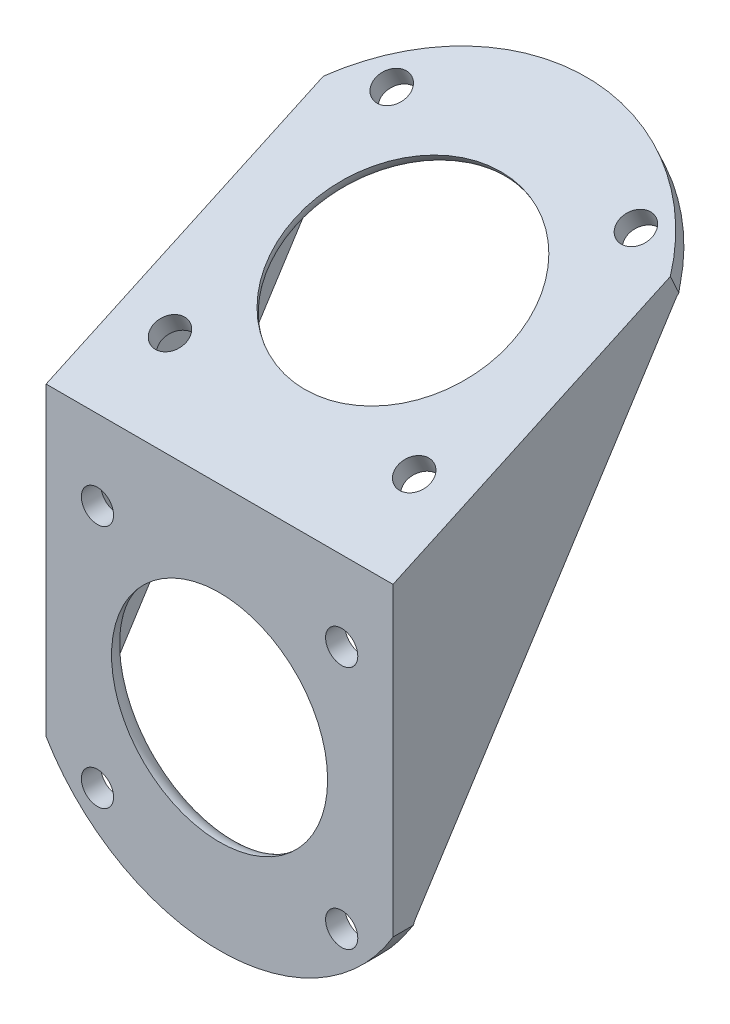
ISO-10303-21;
HEADER;
FILE_DESCRIPTION(('STEP AP214'),'2;1');
FILE_NAME('part.step','',(''),(''),'','','');
FILE_SCHEMA(('AUTOMOTIVE_DESIGN { 1 0 10303 214 1 1 1 1 }'));
ENDSEC;
DATA;
#1=APPLICATION_CONTEXT('core data for automotive mechanical design processes');
#2=APPLICATION_PROTOCOL_DEFINITION('international standard','automotive_design',2000,#1);
#3=PRODUCT_CONTEXT('',#1,'mechanical');
#4=PRODUCT('Part','Part','',(#3));
#5=PRODUCT_RELATED_PRODUCT_CATEGORY('part','',(#4));
#6=PRODUCT_DEFINITION_FORMATION('','',#4);
#7=PRODUCT_DEFINITION_CONTEXT('part definition',#1,'design');
#8=PRODUCT_DEFINITION('design','',#6,#7);
#9=PRODUCT_DEFINITION_SHAPE('','',#8);
#10=(LENGTH_UNIT() NAMED_UNIT(*) SI_UNIT(.MILLI.,.METRE.));
#11=(NAMED_UNIT(*) PLANE_ANGLE_UNIT() SI_UNIT($,.RADIAN.));
#12=(NAMED_UNIT(*) SI_UNIT($,.STERADIAN.) SOLID_ANGLE_UNIT());
#13=UNCERTAINTY_MEASURE_WITH_UNIT(LENGTH_MEASURE(1.E-05),#10,'distance_accuracy_value','');
#14=(GEOMETRIC_REPRESENTATION_CONTEXT(3) GLOBAL_UNCERTAINTY_ASSIGNED_CONTEXT((#13)) GLOBAL_UNIT_ASSIGNED_CONTEXT((#10,
#11,#12)) REPRESENTATION_CONTEXT('',''));
#15=CARTESIAN_POINT('',(0.,0.,0.));
#16=DIRECTION('',(0.,0.,1.));
#17=DIRECTION('',(1.,0.,0.));
#18=AXIS2_PLACEMENT_3D('',#15,#16,#17);
#19=CARTESIAN_POINT('',(0.,0.,0.));
#20=DIRECTION('',(0.,0.,1.));
#21=DIRECTION('',(1.,0.,0.));
#22=AXIS2_PLACEMENT_3D('',#19,#20,#21);
#23=PLANE('',#22);
#24=CARTESIAN_POINT('',(0.,0.,0.));
#25=DIRECTION('',(0.,0.,1.));
#26=DIRECTION('',(1.,0.,0.));
#27=AXIS2_PLACEMENT_3D('',#24,#25,#26);
#28=CIRCLE('',#27,13.07313);
#29=CARTESIAN_POINT('',(13.07313,0.,0.));
#30=VERTEX_POINT('',#29);
#31=EDGE_CURVE('E206',#30,#30,#28,.T.);
#32=ORIENTED_EDGE('',*,*,#31,.T.);
#33=EDGE_LOOP('',(#32));
#34=FACE_BOUND('',#33,.T.);
#35=CARTESIAN_POINT('',(-12.5157900270019,12.5157900270019,0.));
#36=DIRECTION('',(0.,0.,1.));
#37=DIRECTION('',(1.,0.,0.));
#38=AXIS2_PLACEMENT_3D('',#35,#36,#37);
#39=CIRCLE('',#38,1.651);
#40=CARTESIAN_POINT('',(-10.8647900270019,12.5157900270019,0.));
#41=VERTEX_POINT('',#40);
#42=EDGE_CURVE('E163',#41,#41,#39,.T.);
#43=ORIENTED_EDGE('',*,*,#42,.T.);
#44=EDGE_LOOP('',(#43));
#45=FACE_BOUND('',#44,.T.);
#46=CARTESIAN_POINT('',(12.5157900270019,-12.5157900270019,0.));
#47=DIRECTION('',(0.,0.,1.));
#48=DIRECTION('',(1.,0.,0.));
#49=AXIS2_PLACEMENT_3D('',#46,#47,#48);
#50=CIRCLE('',#49,1.651);
#51=CARTESIAN_POINT('',(14.1667900270019,-12.5157900270019,0.));
#52=VERTEX_POINT('',#51);
#53=EDGE_CURVE('E173',#52,#52,#50,.T.);
#54=ORIENTED_EDGE('',*,*,#53,.T.);
#55=EDGE_LOOP('',(#54));
#56=FACE_BOUND('',#55,.T.);
#57=CARTESIAN_POINT('',(-12.5157900270019,-12.5157900270019,0.));
#58=DIRECTION('',(0.,0.,1.));
#59=DIRECTION('',(1.,0.,0.));
#60=AXIS2_PLACEMENT_3D('',#57,#58,#59);
#61=CIRCLE('',#60,1.651);
#62=CARTESIAN_POINT('',(-10.8647900270019,-12.5157900270019,0.));
#63=VERTEX_POINT('',#62);
#64=EDGE_CURVE('E179',#63,#63,#61,.T.);
#65=ORIENTED_EDGE('',*,*,#64,.T.);
#66=EDGE_LOOP('',(#65));
#67=FACE_BOUND('',#66,.T.);
#68=CARTESIAN_POINT('',(12.5157900270019,12.5157900270019,0.));
#69=DIRECTION('',(0.,0.,1.));
#70=DIRECTION('',(1.,0.,0.));
#71=AXIS2_PLACEMENT_3D('',#68,#69,#70);
#72=CIRCLE('',#71,1.651);
#73=CARTESIAN_POINT('',(14.1667900270019,12.5157900270019,0.));
#74=VERTEX_POINT('',#73);
#75=EDGE_CURVE('E167',#74,#74,#72,.T.);
#76=ORIENTED_EDGE('',*,*,#75,.T.);
#77=EDGE_LOOP('',(#76));
#78=FACE_BOUND('',#77,.T.);
#79=DIRECTION('',(0.,1.,0.));
#80=VECTOR('',#79,1.);
#81=CARTESIAN_POINT('',(15.78,19.4214547521063,0.));
#82=LINE('',#81,#80);
#83=CARTESIAN_POINT('',(15.78,-11.1870585452423,0.));
#84=VERTEX_POINT('',#83);
#85=CARTESIAN_POINT('',(15.78,19.4214547521063,0.));
#86=VERTEX_POINT('',#85);
#87=EDGE_CURVE('E323',#84,#86,#82,.T.);
#88=ORIENTED_EDGE('',*,*,#87,.F.);
#89=DIRECTION('',(1.,0.,0.));
#90=VECTOR('',#89,1.);
#91=CARTESIAN_POINT('',(17.78,-11.1870585452423,0.));
#92=LINE('',#91,#90);
#93=CARTESIAN_POINT('',(17.4178391916254,-11.1870585452423,0.));
#94=VERTEX_POINT('',#93);
#95=EDGE_CURVE('E212',#84,#94,#92,.T.);
#96=ORIENTED_EDGE('',*,*,#95,.T.);
#97=CARTESIAN_POINT('',(0.,0.,0.));
#98=DIRECTION('',(0.,0.,1.));
#99=DIRECTION('',(1.,0.,0.));
#100=AXIS2_PLACEMENT_3D('',#97,#98,#99);
#101=CIRCLE('',#100,20.701);
#102=CARTESIAN_POINT('',(-17.4178391916254,-11.1870585452423,0.));
#103=VERTEX_POINT('',#102);
#104=EDGE_CURVE('E185',#103,#94,#101,.T.);
#105=ORIENTED_EDGE('',*,*,#104,.F.);
#106=DIRECTION('',(-1.,0.,0.));
#107=VECTOR('',#106,1.);
#108=CARTESIAN_POINT('',(0.,-11.1870585452423,0.));
#109=LINE('',#108,#107);
#110=CARTESIAN_POINT('',(-15.78,-11.1870585452423,0.));
#111=VERTEX_POINT('',#110);
#112=EDGE_CURVE('E209',#103,#111,#109,.F.);
#113=ORIENTED_EDGE('',*,*,#112,.T.);
#114=DIRECTION('',(0.,1.,0.));
#115=VECTOR('',#114,1.);
#116=CARTESIAN_POINT('',(-15.78,19.4214547521063,0.));
#117=LINE('',#116,#115);
#118=CARTESIAN_POINT('',(-15.78,19.4214547521063,0.));
#119=VERTEX_POINT('',#118);
#120=EDGE_CURVE('E306',#111,#119,#117,.T.);
#121=ORIENTED_EDGE('',*,*,#120,.T.);
#122=DIRECTION('',(-1.,0.,0.));
#123=VECTOR('',#122,1.);
#124=CARTESIAN_POINT('',(0.,19.4214547521063,0.));
#125=LINE('',#124,#123);
#126=EDGE_CURVE('E137',#86,#119,#125,.T.);
#127=ORIENTED_EDGE('',*,*,#126,.F.);
#128=EDGE_LOOP('',(#88,#96,#105,#113,#121,#127));
#129=FACE_BOUND('',#128,.T.);
#130=ADVANCED_FACE('F32',(#34,#45,#56,#67,#78,#129),#23,.F.);
#131=CARTESIAN_POINT('',(0.,27.5616697394959,-17.6332017695934));
#132=DIRECTION('',(0.,0.907923839622828,0.419135182780617));
#133=DIRECTION('',(1.,0.,0.));
#134=AXIS2_PLACEMENT_3D('',#131,#132,#133);
#135=PLANE('',#134);
#136=CARTESIAN_POINT('',(0.,27.5616697394959,-17.6332017695934));
#137=DIRECTION('',(0.,0.907923839622828,0.419135182780617));
#138=DIRECTION('',(0.,-0.419135182780617,0.907923839622828));
#139=AXIS2_PLACEMENT_3D('',#136,#137,#138);
#140=CIRCLE('',#139,13.07313);
#141=CARTESIAN_POINT('',(0.,22.0822610074311,-5.763795384105));
#142=VERTEX_POINT('',#141);
#143=EDGE_CURVE('E203',#142,#142,#140,.T.);
#144=ORIENTED_EDGE('',*,*,#143,.T.);
#145=EDGE_LOOP('',(#144));
#146=FACE_BOUND('',#145,.T.);
#147=CARTESIAN_POINT('',(-12.5157900270019,22.3158617988846,-6.26981763236474));
#148=DIRECTION('',(0.,-0.907923839622828,-0.419135182780617));
#149=DIRECTION('',(1.,0.,0.));
#150=AXIS2_PLACEMENT_3D('',#147,#148,#149);
#151=CIRCLE('',#150,1.651);
#152=CARTESIAN_POINT('',(-10.8647900270019,22.3158617988846,-6.26981763236474));
#153=VERTEX_POINT('',#152);
#154=EDGE_CURVE('E343',#153,#153,#151,.T.);
#155=ORIENTED_EDGE('',*,*,#154,.F.);
#156=EDGE_LOOP('',(#155));
#157=FACE_BOUND('',#156,.T.);
#158=CARTESIAN_POINT('',(12.5157900270019,22.3158617988846,-6.26981763236474));
#159=DIRECTION('',(0.,-0.907923839622828,-0.419135182780617));
#160=DIRECTION('',(1.,0.,0.));
#161=AXIS2_PLACEMENT_3D('',#158,#159,#160);
#162=CIRCLE('',#161,1.651);
#163=CARTESIAN_POINT('',(14.1667900270019,22.3158617988846,-6.26981763236474));
#164=VERTEX_POINT('',#163);
#165=EDGE_CURVE('E347',#164,#164,#162,.T.);
#166=ORIENTED_EDGE('',*,*,#165,.F.);
#167=EDGE_LOOP('',(#166));
#168=FACE_BOUND('',#167,.T.);
#169=CARTESIAN_POINT('',(12.5157900270019,32.8074776801072,-28.996585906822));
#170=DIRECTION('',(0.,-0.907923839622828,-0.419135182780617));
#171=DIRECTION('',(1.,0.,0.));
#172=AXIS2_PLACEMENT_3D('',#169,#170,#171);
#173=CIRCLE('',#172,1.651);
#174=CARTESIAN_POINT('',(14.1667900270019,32.8074776801072,-28.996585906822));
#175=VERTEX_POINT('',#174);
#176=EDGE_CURVE('E353',#175,#175,#173,.T.);
#177=ORIENTED_EDGE('',*,*,#176,.F.);
#178=EDGE_LOOP('',(#177));
#179=FACE_BOUND('',#178,.T.);
#180=CARTESIAN_POINT('',(-12.5157900270019,32.8074776801072,-28.996585906822));
#181=DIRECTION('',(0.,-0.907923839622828,-0.419135182780617));
#182=DIRECTION('',(1.,0.,0.));
#183=AXIS2_PLACEMENT_3D('',#180,#181,#182);
#184=CIRCLE('',#183,1.651);
#185=CARTESIAN_POINT('',(-10.8647900270019,32.8074776801072,-28.996585906822));
#186=VERTEX_POINT('',#185);
#187=EDGE_CURVE('E359',#186,#186,#184,.T.);
#188=ORIENTED_EDGE('',*,*,#187,.F.);
#189=EDGE_LOOP('',(#188));
#190=FACE_BOUND('',#189,.T.);
#191=DIRECTION('',(0.,0.419135182780617,-0.907923839622828));
#192=VECTOR('',#191,1.);
#193=CARTESIAN_POINT('',(-15.78,32.0053527480987,-27.2590358798955));
#194=LINE('',#193,#192);
#195=CARTESIAN_POINT('',(-15.78,32.2505595676335,-27.7901989180751));
#196=VERTEX_POINT('',#195);
#197=EDGE_CURVE('E311',#119,#196,#194,.T.);
#198=ORIENTED_EDGE('',*,*,#197,.T.);
#199=DIRECTION('',(-1.,0.,0.));
#200=VECTOR('',#199,1.);
#201=CARTESIAN_POINT('',(0.,32.2505595676335,-27.7901989180751));
#202=LINE('',#201,#200);
#203=CARTESIAN_POINT('',(-17.4178391916254,32.2505595676335,-27.7901989180751));
#204=VERTEX_POINT('',#203);
#205=EDGE_CURVE('E228',#196,#204,#202,.T.);
#206=ORIENTED_EDGE('',*,*,#205,.T.);
#207=CARTESIAN_POINT('',(0.,27.5616697394959,-17.6332017695934));
#208=DIRECTION('',(0.,-0.907923839622828,-0.419135182780617));
#209=DIRECTION('',(1.,0.,0.));
#210=AXIS2_PLACEMENT_3D('',#207,#208,#209);
#211=CIRCLE('',#210,20.701);
#212=CARTESIAN_POINT('',(17.4178391916254,32.2505595676335,-27.7901989180751));
#213=VERTEX_POINT('',#212);
#214=EDGE_CURVE('E145',#204,#213,#211,.T.);
#215=ORIENTED_EDGE('',*,*,#214,.T.);
#216=DIRECTION('',(1.,0.,0.));
#217=VECTOR('',#216,1.);
#218=CARTESIAN_POINT('',(15.78,32.2505595676335,-27.7901989180751));
#219=LINE('',#218,#217);
#220=CARTESIAN_POINT('',(15.78,32.2505595676335,-27.7901989180751));
#221=VERTEX_POINT('',#220);
#222=EDGE_CURVE('E225',#213,#221,#219,.F.);
#223=ORIENTED_EDGE('',*,*,#222,.T.);
#224=DIRECTION('',(0.,0.419135182780617,-0.907923839622828));
#225=VECTOR('',#224,1.);
#226=CARTESIAN_POINT('',(15.78,32.0053527480987,-27.2590358798955));
#227=LINE('',#226,#225);
#228=EDGE_CURVE('E307',#86,#221,#227,.T.);
#229=ORIENTED_EDGE('',*,*,#228,.F.);
#230=ORIENTED_EDGE('',*,*,#126,.T.);
#231=EDGE_LOOP('',(#198,#206,#215,#223,#229,#230));
#232=FACE_BOUND('',#231,.T.);
#233=ADVANCED_FACE('F280',(#146,#157,#168,#179,#190,#232),#135,.F.);
#234=CARTESIAN_POINT('',(0.,0.,2.));
#235=DIRECTION('',(0.,0.,1.));
#236=DIRECTION('',(1.,0.,0.));
#237=AXIS2_PLACEMENT_3D('',#234,#235,#236);
#238=PLANE('',#237);
#239=CARTESIAN_POINT('',(-12.5157900270019,12.5157900270019,2.));
#240=DIRECTION('',(0.,0.,1.));
#241=DIRECTION('',(1.,0.,0.));
#242=AXIS2_PLACEMENT_3D('',#239,#240,#241);
#243=CIRCLE('',#242,1.651);
#244=CARTESIAN_POINT('',(-10.8647900270019,12.5157900270019,2.));
#245=VERTEX_POINT('',#244);
#246=EDGE_CURVE('E164',#245,#245,#243,.T.);
#247=ORIENTED_EDGE('',*,*,#246,.F.);
#248=EDGE_LOOP('',(#247));
#249=FACE_BOUND('',#248,.T.);
#250=CARTESIAN_POINT('',(12.5157900270019,-12.5157900270019,2.));
#251=DIRECTION('',(0.,0.,1.));
#252=DIRECTION('',(1.,0.,0.));
#253=AXIS2_PLACEMENT_3D('',#250,#251,#252);
#254=CIRCLE('',#253,1.651);
#255=CARTESIAN_POINT('',(14.1667900270019,-12.5157900270019,2.));
#256=VERTEX_POINT('',#255);
#257=EDGE_CURVE('E176',#256,#256,#254,.T.);
#258=ORIENTED_EDGE('',*,*,#257,.F.);
#259=EDGE_LOOP('',(#258));
#260=FACE_BOUND('',#259,.T.);
#261=CARTESIAN_POINT('',(0.,0.,2.));
#262=DIRECTION('',(0.,0.,1.));
#263=DIRECTION('',(1.,0.,0.));
#264=AXIS2_PLACEMENT_3D('',#261,#262,#263);
#265=CIRCLE('',#264,20.701);
#266=CARTESIAN_POINT('',(-17.78,-10.6020281550277,2.));
#267=VERTEX_POINT('',#266);
#268=CARTESIAN_POINT('',(17.78,-10.6020281550277,2.));
#269=VERTEX_POINT('',#268);
#270=EDGE_CURVE('E188',#267,#269,#265,.T.);
#271=ORIENTED_EDGE('',*,*,#270,.T.);
#272=DIRECTION('',(0.,1.,0.));
#273=VECTOR('',#272,1.);
#274=CARTESIAN_POINT('',(17.78,-10.6020281550277,2.));
#275=LINE('',#274,#273);
#276=CARTESIAN_POINT('',(17.78,20.701,2.00000000000001));
#277=VERTEX_POINT('',#276);
#278=EDGE_CURVE('E191',#269,#277,#275,.T.);
#279=ORIENTED_EDGE('',*,*,#278,.T.);
#280=DIRECTION('',(-1.,0.,0.));
#281=VECTOR('',#280,1.);
#282=CARTESIAN_POINT('',(-17.78,20.701,2.));
#283=LINE('',#282,#281);
#284=CARTESIAN_POINT('',(-17.78,20.701,2.));
#285=VERTEX_POINT('',#284);
#286=EDGE_CURVE('E194',#277,#285,#283,.T.);
#287=ORIENTED_EDGE('',*,*,#286,.T.);
#288=DIRECTION('',(0.,-1.,0.));
#289=VECTOR('',#288,1.);
#290=CARTESIAN_POINT('',(-17.78,-10.6020281550277,2.));
#291=LINE('',#290,#289);
#292=EDGE_CURVE('E150',#285,#267,#291,.T.);
#293=ORIENTED_EDGE('',*,*,#292,.T.);
#294=EDGE_LOOP('',(#271,#279,#287,#293));
#295=FACE_BOUND('',#294,.T.);
#296=CARTESIAN_POINT('',(-12.5157900270019,-12.5157900270019,2.));
#297=DIRECTION('',(0.,0.,1.));
#298=DIRECTION('',(1.,0.,0.));
#299=AXIS2_PLACEMENT_3D('',#296,#297,#298);
#300=CIRCLE('',#299,1.651);
#301=CARTESIAN_POINT('',(-10.8647900270019,-12.5157900270019,2.));
#302=VERTEX_POINT('',#301);
#303=EDGE_CURVE('E182',#302,#302,#300,.T.);
#304=ORIENTED_EDGE('',*,*,#303,.F.);
#305=EDGE_LOOP('',(#304));
#306=FACE_BOUND('',#305,.T.);
#307=CARTESIAN_POINT('',(12.5157900270019,12.5157900270019,2.));
#308=DIRECTION('',(0.,0.,1.));
#309=DIRECTION('',(1.,0.,0.));
#310=AXIS2_PLACEMENT_3D('',#307,#308,#309);
#311=CIRCLE('',#310,1.651);
#312=CARTESIAN_POINT('',(14.1667900270019,12.5157900270019,2.));
#313=VERTEX_POINT('',#312);
#314=EDGE_CURVE('E170',#313,#313,#311,.T.);
#315=ORIENTED_EDGE('',*,*,#314,.F.);
#316=EDGE_LOOP('',(#315));
#317=FACE_BOUND('',#316,.T.);
#318=CARTESIAN_POINT('',(0.,0.,2.));
#319=DIRECTION('',(0.,0.,1.));
#320=DIRECTION('',(1.,0.,0.));
#321=AXIS2_PLACEMENT_3D('',#318,#319,#320);
#322=CIRCLE('',#321,11.07313);
#323=CARTESIAN_POINT('',(11.07313,0.,2.));
#324=VERTEX_POINT('',#323);
#325=EDGE_CURVE('E160',#324,#324,#322,.T.);
#326=ORIENTED_EDGE('',*,*,#325,.F.);
#327=EDGE_LOOP('',(#326));
#328=FACE_BOUND('',#327,.T.);
#329=ADVANCED_FACE('F369',(#249,#260,#295,#306,#317,#328),#238,.T.);
#330=CARTESIAN_POINT('',(0.,0.,2.));
#331=DIRECTION('',(0.,0.,-1.));
#332=DIRECTION('',(-1.,0.,0.));
#333=AXIS2_PLACEMENT_3D('',#330,#331,#332);
#334=CYLINDRICAL_SURFACE('',#333,20.701);
#335=DIRECTION('',(0.,0.,-1.));
#336=VECTOR('',#335,1.);
#337=CARTESIAN_POINT('',(-17.78,-10.6020281550277,2.));
#338=LINE('',#337,#336);
#339=CARTESIAN_POINT('',(-17.78,-10.6020281550277,-0.0874782504438334));
#340=VERTEX_POINT('',#339);
#341=EDGE_CURVE('E197',#267,#340,#338,.T.);
#342=ORIENTED_EDGE('',*,*,#341,.T.);
#343=CARTESIAN_POINT('',(-17.78,-10.6020281550277,-0.0874782504438332));
#344=CARTESIAN_POINT('',(-17.7512279440699,-10.6502827459432,-0.072717126070131));
#345=CARTESIAN_POINT('',(-17.7220046579674,-10.6988419886516,-0.0598603438074818));
#346=CARTESIAN_POINT('',(-17.6629033146214,-10.7961316553277,-0.0379470868485084));
#347=CARTESIAN_POINT('',(-17.6330284914694,-10.8448605239403,-0.0288750067908097));
#348=CARTESIAN_POINT('',(-17.5726314536715,-10.942454864309,-0.0144011258893351));
#349=CARTESIAN_POINT('',(-17.5421092700097,-10.9913203294306,-0.00899914979370105));
#350=CARTESIAN_POINT('',(-17.4804077530037,-11.0891893010427,-0.00179106641959754));
#351=CARTESIAN_POINT('',(-17.4492262051928,-11.138192530159,-9.22016693959539E-08));
#352=CARTESIAN_POINT('',(-17.4178391916254,-11.1870585452423,0.));
#353=B_SPLINE_CURVE_WITH_KNOTS('',3,(#343,#344,#345,#346,#347,#348,#349,#350,#351,#352),
.UNSPECIFIED.,.F.,.F.,(4,2,2,2,4),(0.,0.174220067104702,0.347714502447699,0.521200652641305,
0.695412353425017),.UNSPECIFIED.);
#354=EDGE_CURVE('E259',#340,#103,#353,.T.);
#355=ORIENTED_EDGE('',*,*,#354,.T.);
#356=ORIENTED_EDGE('',*,*,#104,.T.);
#357=CARTESIAN_POINT('',(17.4178391916254,-11.1870585452423,0.));
#358=CARTESIAN_POINT('',(17.4492262051928,-11.138192530159,-9.22016684831085E-08));
#359=CARTESIAN_POINT('',(17.4804077530037,-11.0891893010427,-0.00179106641959657));
#360=CARTESIAN_POINT('',(17.5421092700097,-10.9913203294306,-0.00899914979370044));
#361=CARTESIAN_POINT('',(17.5726314536715,-10.942454864309,-0.014401125889335));
#362=CARTESIAN_POINT('',(17.6330284914694,-10.8448605239403,-0.0288750067908099));
#363=CARTESIAN_POINT('',(17.6629033146214,-10.7961316553277,-0.0379470868485084));
#364=CARTESIAN_POINT('',(17.7220046579674,-10.6988419886516,-0.0598603438074816));
#365=CARTESIAN_POINT('',(17.7512279440699,-10.6502827459432,-0.0727171260701309));
#366=CARTESIAN_POINT('',(17.78,-10.6020281550277,-0.0874782504438338));
#367=B_SPLINE_CURVE_WITH_KNOTS('',3,(#357,#358,#359,#360,#361,#362,#363,#364,#365,#366),
.UNSPECIFIED.,.F.,.F.,(4,2,2,2,4),(0.,0.174211700783711,0.347697850977319,0.521192286320317,
0.695412353425021),.UNSPECIFIED.);
#368=CARTESIAN_POINT('',(17.78,-10.6020281550277,-0.0874782504438334));
#369=VERTEX_POINT('',#368);
#370=EDGE_CURVE('E231',#94,#369,#367,.T.);
#371=ORIENTED_EDGE('',*,*,#370,.T.);
#372=DIRECTION('',(0.,0.,-1.));
#373=VECTOR('',#372,1.);
#374=CARTESIAN_POINT('',(17.78,-10.6020281550277,2.));
#375=LINE('',#374,#373);
#376=EDGE_CURVE('E201',#269,#369,#375,.T.);
#377=ORIENTED_EDGE('',*,*,#376,.F.);
#378=ORIENTED_EDGE('',*,*,#270,.F.);
#379=EDGE_LOOP('',(#342,#355,#356,#371,#377,#378));
#380=FACE_BOUND('',#379,.T.);
#381=ADVANCED_FACE('F241',(#380),#334,.T.);
#382=CARTESIAN_POINT('',(17.78,-10.6020281550277,2.));
#383=DIRECTION('',(-1.,0.,0.));
#384=DIRECTION('',(0.,0.,1.));
#385=AXIS2_PLACEMENT_3D('',#382,#383,#384);
#386=PLANE('',#385);
#387=DIRECTION('',(0.,-0.419135182780617,0.907923839622828));
#388=VECTOR('',#387,1.);
#389=CARTESIAN_POINT('',(17.78,33.8212004273443,-26.4207655143342));
#390=LINE('',#389,#388);
#391=CARTESIAN_POINT('',(17.78,33.8212004273443,-26.4207655143342));
#392=VERTEX_POINT('',#391);
#393=EDGE_CURVE('E144',#392,#277,#390,.T.);
#394=ORIENTED_EDGE('',*,*,#393,.T.);
#395=ORIENTED_EDGE('',*,*,#278,.F.);
#396=ORIENTED_EDGE('',*,*,#376,.T.);
#397=CARTESIAN_POINT('',(17.78,-11.1870585452423,-2.));
#398=DIRECTION('',(-1.,0.,0.));
#399=DIRECTION('',(0.,0.,1.));
#400=AXIS2_PLACEMENT_3D('',#397,#398,#399);
#401=CIRCLE('',#400,2.);
#402=CARTESIAN_POINT('',(17.78,-10.1092229202796,-0.315283298129554));
#403=VERTEX_POINT('',#402);
#404=EDGE_CURVE('E239',#369,#403,#401,.T.);
#405=ORIENTED_EDGE('',*,*,#404,.T.);
#406=DIRECTION('',(0.,-0.842358350935223,0.538917812481357));
#407=VECTOR('',#406,1.);
#408=CARTESIAN_POINT('',(17.78,-10.6020281550277,0.));
#409=LINE('',#408,#407);
#410=CARTESIAN_POINT('',(17.78,31.5125475133505,-26.9437525817659));
#411=VERTEX_POINT('',#410);
#412=EDGE_CURVE('E330',#411,#403,#409,.T.);
#413=ORIENTED_EDGE('',*,*,#412,.F.);
#414=CARTESIAN_POINT('',(17.78,30.4347118883878,-28.6284692836364));
#415=DIRECTION('',(-1.,0.,0.));
#416=DIRECTION('',(0.,0.,1.));
#417=AXIS2_PLACEMENT_3D('',#414,#415,#416);
#418=CIRCLE('',#417,2.);
#419=CARTESIAN_POINT('',(17.78,31.9259291590722,-27.2957010923846));
#420=VERTEX_POINT('',#419);
#421=EDGE_CURVE('E288',#411,#420,#418,.T.);
#422=ORIENTED_EDGE('',*,*,#421,.T.);
#423=DIRECTION('',(0.,-0.907923839622828,-0.419135182780617));
#424=VECTOR('',#423,1.);
#425=CARTESIAN_POINT('',(17.78,33.8212004273443,-26.4207655143342));
#426=LINE('',#425,#424);
#427=EDGE_CURVE('E48',#392,#420,#426,.T.);
#428=ORIENTED_EDGE('',*,*,#427,.F.);
#429=EDGE_LOOP('',(#394,#395,#396,#405,#413,#422,#428));
#430=FACE_BOUND('',#429,.T.);
#431=ADVANCED_FACE('F473',(#430),#386,.F.);
#432=CARTESIAN_POINT('',(-17.78,-10.6020281550277,2.));
#433=DIRECTION('',(1.,0.,0.));
#434=DIRECTION('',(0.,0.,-1.));
#435=AXIS2_PLACEMENT_3D('',#432,#433,#434);
#436=PLANE('',#435);
#437=DIRECTION('',(0.,-0.907923839622828,-0.419135182780617));
#438=VECTOR('',#437,1.);
#439=CARTESIAN_POINT('',(-17.78,33.8212004273443,-26.4207655143342));
#440=LINE('',#439,#438);
#441=CARTESIAN_POINT('',(-17.78,33.8212004273443,-26.4207655143342));
#442=VERTEX_POINT('',#441);
#443=CARTESIAN_POINT('',(-17.78,31.9259291590722,-27.2957010923846));
#444=VERTEX_POINT('',#443);
#445=EDGE_CURVE('E56',#442,#444,#440,.T.);
#446=ORIENTED_EDGE('',*,*,#445,.T.);
#447=CARTESIAN_POINT('',(-17.78,30.4347118883878,-28.6284692836364));
#448=DIRECTION('',(1.,0.,0.));
#449=DIRECTION('',(0.,0.,-1.));
#450=AXIS2_PLACEMENT_3D('',#447,#448,#449);
#451=CIRCLE('',#450,2.);
#452=CARTESIAN_POINT('',(-17.78,31.5125475133505,-26.9437525817659));
#453=VERTEX_POINT('',#452);
#454=EDGE_CURVE('E273',#444,#453,#451,.T.);
#455=ORIENTED_EDGE('',*,*,#454,.T.);
#456=DIRECTION('',(0.,-0.842358350935223,0.538917812481357));
#457=VECTOR('',#456,1.);
#458=CARTESIAN_POINT('',(-17.78,-10.6020281550277,0.));
#459=LINE('',#458,#457);
#460=CARTESIAN_POINT('',(-17.78,-10.1092229202796,-0.315283298129554));
#461=VERTEX_POINT('',#460);
#462=EDGE_CURVE('E299',#453,#461,#459,.T.);
#463=ORIENTED_EDGE('',*,*,#462,.T.);
#464=CARTESIAN_POINT('',(-17.78,-11.1870585452423,-2.));
#465=DIRECTION('',(1.,0.,0.));
#466=DIRECTION('',(0.,0.,-1.));
#467=AXIS2_PLACEMENT_3D('',#464,#465,#466);
#468=CIRCLE('',#467,2.);
#469=EDGE_CURVE('E266',#461,#340,#468,.T.);
#470=ORIENTED_EDGE('',*,*,#469,.T.);
#471=ORIENTED_EDGE('',*,*,#341,.F.);
#472=ORIENTED_EDGE('',*,*,#292,.F.);
#473=DIRECTION('',(0.,0.419135182780617,-0.907923839622828));
#474=VECTOR('',#473,1.);
#475=CARTESIAN_POINT('',(-17.78,33.8212004273443,-26.4207655143342));
#476=LINE('',#475,#474);
#477=EDGE_CURVE('E141',#285,#442,#476,.T.);
#478=ORIENTED_EDGE('',*,*,#477,.T.);
#479=EDGE_LOOP('',(#446,#455,#463,#470,#471,#472,#478));
#480=FACE_BOUND('',#479,.T.);
#481=ADVANCED_FACE('F148',(#480),#436,.F.);
#482=CARTESIAN_POINT('',(-12.5157900270019,-12.5157900270019,2.));
#483=DIRECTION('',(0.,0.,-1.));
#484=DIRECTION('',(-1.,0.,0.));
#485=AXIS2_PLACEMENT_3D('',#482,#483,#484);
#486=CYLINDRICAL_SURFACE('',#485,1.651);
#487=ORIENTED_EDGE('',*,*,#303,.T.);
#488=EDGE_LOOP('',(#487));
#489=FACE_BOUND('',#488,.T.);
#490=ORIENTED_EDGE('',*,*,#64,.F.);
#491=EDGE_LOOP('',(#490));
#492=FACE_BOUND('',#491,.T.);
#493=ADVANCED_FACE('F465',(#489,#492),#486,.F.);
#494=CARTESIAN_POINT('',(12.5157900270019,-12.5157900270019,2.));
#495=DIRECTION('',(0.,0.,-1.));
#496=DIRECTION('',(-1.,0.,0.));
#497=AXIS2_PLACEMENT_3D('',#494,#495,#496);
#498=CYLINDRICAL_SURFACE('',#497,1.651);
#499=ORIENTED_EDGE('',*,*,#257,.T.);
#500=EDGE_LOOP('',(#499));
#501=FACE_BOUND('',#500,.T.);
#502=ORIENTED_EDGE('',*,*,#53,.F.);
#503=EDGE_LOOP('',(#502));
#504=FACE_BOUND('',#503,.T.);
#505=ADVANCED_FACE('F458',(#501,#504),#498,.F.);
#506=CARTESIAN_POINT('',(12.5157900270019,12.5157900270019,2.));
#507=DIRECTION('',(0.,0.,-1.));
#508=DIRECTION('',(-1.,0.,0.));
#509=AXIS2_PLACEMENT_3D('',#506,#507,#508);
#510=CYLINDRICAL_SURFACE('',#509,1.651);
#511=ORIENTED_EDGE('',*,*,#314,.T.);
#512=EDGE_LOOP('',(#511));
#513=FACE_BOUND('',#512,.T.);
#514=ORIENTED_EDGE('',*,*,#75,.F.);
#515=EDGE_LOOP('',(#514));
#516=FACE_BOUND('',#515,.T.);
#517=ADVANCED_FACE('F456',(#513,#516),#510,.F.);
#518=CARTESIAN_POINT('',(-12.5157900270019,12.5157900270019,2.));
#519=DIRECTION('',(0.,0.,-1.));
#520=DIRECTION('',(-1.,0.,0.));
#521=AXIS2_PLACEMENT_3D('',#518,#519,#520);
#522=CYLINDRICAL_SURFACE('',#521,1.651);
#523=ORIENTED_EDGE('',*,*,#246,.T.);
#524=EDGE_LOOP('',(#523));
#525=FACE_BOUND('',#524,.T.);
#526=ORIENTED_EDGE('',*,*,#42,.F.);
#527=EDGE_LOOP('',(#526));
#528=FACE_BOUND('',#527,.T.);
#529=ADVANCED_FACE('F279',(#525,#528),#522,.F.);
#530=CARTESIAN_POINT('',(0.,29.3775174187415,-16.7949314040322));
#531=DIRECTION('',(0.,-0.907923839622828,-0.419135182780617));
#532=DIRECTION('',(0.,0.419135182780617,-0.907923839622828));
#533=AXIS2_PLACEMENT_3D('',#530,#531,#532);
#534=CYLINDRICAL_SURFACE('',#533,20.701);
#535=ORIENTED_EDGE('',*,*,#214,.F.);
#536=CARTESIAN_POINT('',(-17.4178391916254,32.2505595676335,-27.7901989180751));
#537=CARTESIAN_POINT('',(-17.4492262051928,32.2300780177577,-27.7458323366786));
#538=CARTESIAN_POINT('',(-17.4804077530037,32.2079129721766,-27.7020917970517));
#539=CARTESIAN_POINT('',(-17.5421092700097,32.1603482521381,-27.6162553859081));
#540=CARTESIAN_POINT('',(-17.5726314536715,32.1349624336044,-27.5741534234282));
#541=CARTESIAN_POINT('',(-17.6330284914694,32.0809160303933,-27.4916117079124));
#542=CARTESIAN_POINT('',(-17.6629033146214,32.0522552893813,-27.4511720343543));
#543=CARTESIAN_POINT('',(-17.7220046579674,31.9915821987595,-27.3720250435909));
#544=CARTESIAN_POINT('',(-17.7512279440699,31.9595563325741,-27.3333256792856));
#545=CARTESIAN_POINT('',(-17.78,31.9259291590722,-27.2957010923846));
#546=B_SPLINE_CURVE_WITH_KNOTS('',3,(#536,#537,#538,#539,#540,#541,#542,#543,#544,#545),
.UNSPECIFIED.,.F.,.F.,(4,2,2,2,4),(0.,0.174211700783717,0.34769785097733,0.521192286320334,
0.695412353425037),.UNSPECIFIED.);
#547=EDGE_CURVE('E135',#204,#444,#546,.T.);
#548=ORIENTED_EDGE('',*,*,#547,.T.);
#549=ORIENTED_EDGE('',*,*,#445,.F.);
#550=CARTESIAN_POINT('',(0.,29.3775174187415,-16.7949314040322));
#551=DIRECTION('',(0.,-0.907923839622828,-0.419135182780617));
#552=DIRECTION('',(1.,0.,0.));
#553=AXIS2_PLACEMENT_3D('',#550,#551,#552);
#554=CIRCLE('',#553,20.701);
#555=EDGE_CURVE('E133',#442,#392,#554,.T.);
#556=ORIENTED_EDGE('',*,*,#555,.T.);
#557=ORIENTED_EDGE('',*,*,#427,.T.);
#558=CARTESIAN_POINT('',(17.78,31.9259291590722,-27.2957010923846));
#559=CARTESIAN_POINT('',(17.7512279440699,31.9595563325741,-27.3333256792856));
#560=CARTESIAN_POINT('',(17.7220046579674,31.9915821987595,-27.3720250435909));
#561=CARTESIAN_POINT('',(17.6629033146214,32.0522552893813,-27.4511720343543));
#562=CARTESIAN_POINT('',(17.6330284914694,32.0809160303933,-27.4916117079124));
#563=CARTESIAN_POINT('',(17.5726314536715,32.1349624336044,-27.5741534234282));
#564=CARTESIAN_POINT('',(17.5421092700097,32.160348252138,-27.6162553859081));
#565=CARTESIAN_POINT('',(17.4804077530037,32.2079129721766,-27.7020917970516));
#566=CARTESIAN_POINT('',(17.4492262051928,32.2300780177577,-27.7458323366786));
#567=CARTESIAN_POINT('',(17.4178391916254,32.2505595676335,-27.7901989180751));
#568=B_SPLINE_CURVE_WITH_KNOTS('',3,(#558,#559,#560,#561,#562,#563,#564,#565,#566,#567),
.UNSPECIFIED.,.F.,.F.,(4,2,2,2,4),(0.,0.174220067104703,0.347714502447699,0.521200652641301,
0.695412353425016),.UNSPECIFIED.);
#569=EDGE_CURVE('E41',#420,#213,#568,.T.);
#570=ORIENTED_EDGE('',*,*,#569,.T.);
#571=EDGE_LOOP('',(#535,#548,#549,#556,#557,#570));
#572=FACE_BOUND('',#571,.T.);
#573=ADVANCED_FACE('F132',(#572),#534,.T.);
#574=CARTESIAN_POINT('',(0.,29.3775174187415,-16.7949314040322));
#575=DIRECTION('',(0.,0.907923839622828,0.419135182780617));
#576=DIRECTION('',(1.,0.,0.));
#577=AXIS2_PLACEMENT_3D('',#574,#575,#576);
#578=PLANE('',#577);
#579=CARTESIAN_POINT('',(0.,29.3775174187415,-16.7949314040322));
#580=DIRECTION('',(0.,-0.907923839622828,-0.419135182780617));
#581=DIRECTION('',(1.,0.,0.));
#582=AXIS2_PLACEMENT_3D('',#579,#580,#581);
#583=CIRCLE('',#582,11.07313);
#584=CARTESIAN_POINT('',(11.07313,29.3775174187415,-16.7949314040322));
#585=VERTEX_POINT('',#584);
#586=EDGE_CURVE('E339',#585,#585,#583,.T.);
#587=ORIENTED_EDGE('',*,*,#586,.T.);
#588=EDGE_LOOP('',(#587));
#589=FACE_BOUND('',#588,.T.);
#590=CARTESIAN_POINT('',(-12.5157900270019,24.1317094781303,-5.4315472668035));
#591=DIRECTION('',(0.,-0.907923839622828,-0.419135182780617));
#592=DIRECTION('',(1.,0.,0.));
#593=AXIS2_PLACEMENT_3D('',#590,#591,#592);
#594=CIRCLE('',#593,1.651);
#595=CARTESIAN_POINT('',(-10.8647900270019,24.1317094781303,-5.4315472668035));
#596=VERTEX_POINT('',#595);
#597=EDGE_CURVE('E344',#596,#596,#594,.T.);
#598=ORIENTED_EDGE('',*,*,#597,.T.);
#599=EDGE_LOOP('',(#598));
#600=FACE_BOUND('',#599,.T.);
#601=CARTESIAN_POINT('',(12.5157900270019,24.1317094781303,-5.4315472668035));
#602=DIRECTION('',(0.,-0.907923839622828,-0.419135182780617));
#603=DIRECTION('',(1.,0.,0.));
#604=AXIS2_PLACEMENT_3D('',#601,#602,#603);
#605=CIRCLE('',#604,1.651);
#606=CARTESIAN_POINT('',(14.1667900270019,24.1317094781303,-5.4315472668035));
#607=VERTEX_POINT('',#606);
#608=EDGE_CURVE('E350',#607,#607,#605,.T.);
#609=ORIENTED_EDGE('',*,*,#608,.T.);
#610=EDGE_LOOP('',(#609));
#611=FACE_BOUND('',#610,.T.);
#612=CARTESIAN_POINT('',(12.5157900270019,34.6233253593528,-28.1583155412608));
#613=DIRECTION('',(0.,-0.907923839622828,-0.419135182780617));
#614=DIRECTION('',(1.,0.,0.));
#615=AXIS2_PLACEMENT_3D('',#612,#613,#614);
#616=CIRCLE('',#615,1.651);
#617=CARTESIAN_POINT('',(14.1667900270019,34.6233253593528,-28.1583155412608));
#618=VERTEX_POINT('',#617);
#619=EDGE_CURVE('E356',#618,#618,#616,.T.);
#620=ORIENTED_EDGE('',*,*,#619,.T.);
#621=EDGE_LOOP('',(#620));
#622=FACE_BOUND('',#621,.T.);
#623=CARTESIAN_POINT('',(-12.5157900270019,34.6233253593528,-28.1583155412608));
#624=DIRECTION('',(0.,-0.907923839622828,-0.419135182780617));
#625=DIRECTION('',(1.,0.,0.));
#626=AXIS2_PLACEMENT_3D('',#623,#624,#625);
#627=CIRCLE('',#626,1.651);
#628=CARTESIAN_POINT('',(-10.8647900270019,34.6233253593528,-28.1583155412608));
#629=VERTEX_POINT('',#628);
#630=EDGE_CURVE('E157',#629,#629,#627,.T.);
#631=ORIENTED_EDGE('',*,*,#630,.T.);
#632=EDGE_LOOP('',(#631));
#633=FACE_BOUND('',#632,.T.);
#634=ORIENTED_EDGE('',*,*,#555,.F.);
#635=ORIENTED_EDGE('',*,*,#477,.F.);
#636=ORIENTED_EDGE('',*,*,#286,.F.);
#637=ORIENTED_EDGE('',*,*,#393,.F.);
#638=EDGE_LOOP('',(#634,#635,#636,#637));
#639=FACE_BOUND('',#638,.T.);
#640=ADVANCED_FACE('F140',(#589,#600,#611,#622,#633,#639),#578,.T.);
#641=CARTESIAN_POINT('',(-12.5157900270019,34.6233253593528,-28.1583155412608));
#642=DIRECTION('',(0.,-0.907923839622828,-0.419135182780617));
#643=DIRECTION('',(0.,0.419135182780617,-0.907923839622828));
#644=AXIS2_PLACEMENT_3D('',#641,#642,#643);
#645=CYLINDRICAL_SURFACE('',#644,1.651);
#646=ORIENTED_EDGE('',*,*,#630,.F.);
#647=EDGE_LOOP('',(#646));
#648=FACE_BOUND('',#647,.T.);
#649=ORIENTED_EDGE('',*,*,#187,.T.);
#650=EDGE_LOOP('',(#649));
#651=FACE_BOUND('',#650,.T.);
#652=ADVANCED_FACE('F366',(#648,#651),#645,.F.);
#653=CARTESIAN_POINT('',(12.5157900270019,34.6233253593528,-28.1583155412608));
#654=DIRECTION('',(0.,-0.907923839622828,-0.419135182780617));
#655=DIRECTION('',(0.,0.419135182780617,-0.907923839622828));
#656=AXIS2_PLACEMENT_3D('',#653,#654,#655);
#657=CYLINDRICAL_SURFACE('',#656,1.651);
#658=ORIENTED_EDGE('',*,*,#619,.F.);
#659=EDGE_LOOP('',(#658));
#660=FACE_BOUND('',#659,.T.);
#661=ORIENTED_EDGE('',*,*,#176,.T.);
#662=EDGE_LOOP('',(#661));
#663=FACE_BOUND('',#662,.T.);
#664=ADVANCED_FACE('F387',(#660,#663),#657,.F.);
#665=CARTESIAN_POINT('',(12.5157900270019,24.1317094781303,-5.4315472668035));
#666=DIRECTION('',(0.,-0.907923839622828,-0.419135182780617));
#667=DIRECTION('',(0.,0.419135182780617,-0.907923839622828));
#668=AXIS2_PLACEMENT_3D('',#665,#666,#667);
#669=CYLINDRICAL_SURFACE('',#668,1.651);
#670=ORIENTED_EDGE('',*,*,#608,.F.);
#671=EDGE_LOOP('',(#670));
#672=FACE_BOUND('',#671,.T.);
#673=ORIENTED_EDGE('',*,*,#165,.T.);
#674=EDGE_LOOP('',(#673));
#675=FACE_BOUND('',#674,.T.);
#676=ADVANCED_FACE('F389',(#672,#675),#669,.F.);
#677=CARTESIAN_POINT('',(-12.5157900270019,24.1317094781303,-5.4315472668035));
#678=DIRECTION('',(0.,-0.907923839622828,-0.419135182780617));
#679=DIRECTION('',(0.,0.419135182780617,-0.907923839622828));
#680=AXIS2_PLACEMENT_3D('',#677,#678,#679);
#681=CYLINDRICAL_SURFACE('',#680,1.651);
#682=ORIENTED_EDGE('',*,*,#597,.F.);
#683=EDGE_LOOP('',(#682));
#684=FACE_BOUND('',#683,.T.);
#685=ORIENTED_EDGE('',*,*,#154,.T.);
#686=EDGE_LOOP('',(#685));
#687=FACE_BOUND('',#686,.T.);
#688=ADVANCED_FACE('F396',(#684,#687),#681,.F.);
#689=CARTESIAN_POINT('',(-15.78,-10.6020281550277,0.));
#690=DIRECTION('',(0.,-0.538917812481358,-0.842358350935223));
#691=DIRECTION('',(0.,0.842358350935223,-0.538917812481357));
#692=AXIS2_PLACEMENT_3D('',#689,#690,#691);
#693=PLANE('',#692);
#694=DIRECTION('',(0.,-0.842358350935223,0.538917812481357));
#695=VECTOR('',#694,1.);
#696=CARTESIAN_POINT('',(-15.78,-10.6020281550277,0.));
#697=LINE('',#696,#695);
#698=CARTESIAN_POINT('',(-15.78,31.5125475133505,-26.9437525817659));
#699=VERTEX_POINT('',#698);
#700=CARTESIAN_POINT('',(-15.78,-10.1092229202796,-0.315283298129554));
#701=VERTEX_POINT('',#700);
#702=EDGE_CURVE('E338',#699,#701,#697,.T.);
#703=ORIENTED_EDGE('',*,*,#702,.T.);
#704=DIRECTION('',(-1.,0.,0.));
#705=VECTOR('',#704,1.);
#706=CARTESIAN_POINT('',(-15.78,-10.1092229202796,-0.315283298129554));
#707=LINE('',#706,#705);
#708=EDGE_CURVE('E222',#701,#461,#707,.T.);
#709=ORIENTED_EDGE('',*,*,#708,.T.);
#710=ORIENTED_EDGE('',*,*,#462,.F.);
#711=DIRECTION('',(-1.,0.,0.));
#712=VECTOR('',#711,1.);
#713=CARTESIAN_POINT('',(-15.78,31.5125475133505,-26.9437525817659));
#714=LINE('',#713,#712);
#715=EDGE_CURVE('E220',#453,#699,#714,.F.);
#716=ORIENTED_EDGE('',*,*,#715,.T.);
#717=EDGE_LOOP('',(#703,#709,#710,#716));
#718=FACE_BOUND('',#717,.T.);
#719=ADVANCED_FACE('F304',(#718),#693,.T.);
#720=CARTESIAN_POINT('',(-15.78,0.,0.));
#721=DIRECTION('',(-1.,0.,0.));
#722=DIRECTION('',(0.,0.,1.));
#723=AXIS2_PLACEMENT_3D('',#720,#721,#722);
#724=PLANE('',#723);
#725=ORIENTED_EDGE('',*,*,#120,.F.);
#726=CARTESIAN_POINT('',(-15.78,-11.1870585452423,-2.));
#727=DIRECTION('',(-1.,0.,0.));
#728=DIRECTION('',(0.,0.,1.));
#729=AXIS2_PLACEMENT_3D('',#726,#727,#728);
#730=CIRCLE('',#729,2.);
#731=EDGE_CURVE('E265',#111,#701,#730,.T.);
#732=ORIENTED_EDGE('',*,*,#731,.T.);
#733=ORIENTED_EDGE('',*,*,#702,.F.);
#734=CARTESIAN_POINT('',(-15.78,30.4347118883878,-28.6284692836364));
#735=DIRECTION('',(-1.,0.,0.));
#736=DIRECTION('',(0.,0.,1.));
#737=AXIS2_PLACEMENT_3D('',#734,#735,#736);
#738=CIRCLE('',#737,2.);
#739=EDGE_CURVE('E289',#699,#196,#738,.T.);
#740=ORIENTED_EDGE('',*,*,#739,.T.);
#741=ORIENTED_EDGE('',*,*,#197,.F.);
#742=EDGE_LOOP('',(#725,#732,#733,#740,#741));
#743=FACE_BOUND('',#742,.T.);
#744=ADVANCED_FACE('F422',(#743),#724,.F.);
#745=CARTESIAN_POINT('',(15.78,-10.6020281550277,0.));
#746=DIRECTION('',(0.,0.538917812481358,0.842358350935223));
#747=DIRECTION('',(0.,-0.842358350935223,0.538917812481357));
#748=AXIS2_PLACEMENT_3D('',#745,#746,#747);
#749=PLANE('',#748);
#750=ORIENTED_EDGE('',*,*,#412,.T.);
#751=DIRECTION('',(1.,0.,0.));
#752=VECTOR('',#751,1.);
#753=CARTESIAN_POINT('',(15.78,-10.1092229202796,-0.315283298129554));
#754=LINE('',#753,#752);
#755=CARTESIAN_POINT('',(15.78,-10.1092229202796,-0.315283298129554));
#756=VERTEX_POINT('',#755);
#757=EDGE_CURVE('E218',#403,#756,#754,.F.);
#758=ORIENTED_EDGE('',*,*,#757,.T.);
#759=DIRECTION('',(0.,-0.842358350935223,0.538917812481357));
#760=VECTOR('',#759,1.);
#761=CARTESIAN_POINT('',(15.78,-10.6020281550277,0.));
#762=LINE('',#761,#760);
#763=CARTESIAN_POINT('',(15.78,31.5125475133505,-26.9437525817659));
#764=VERTEX_POINT('',#763);
#765=EDGE_CURVE('E320',#764,#756,#762,.T.);
#766=ORIENTED_EDGE('',*,*,#765,.F.);
#767=DIRECTION('',(1.,0.,0.));
#768=VECTOR('',#767,1.);
#769=CARTESIAN_POINT('',(17.78,31.5125475133505,-26.9437525817659));
#770=LINE('',#769,#768);
#771=EDGE_CURVE('E215',#764,#411,#770,.T.);
#772=ORIENTED_EDGE('',*,*,#771,.T.);
#773=EDGE_LOOP('',(#750,#758,#766,#772));
#774=FACE_BOUND('',#773,.T.);
#775=ADVANCED_FACE('F427',(#774),#749,.F.);
#776=CARTESIAN_POINT('',(15.78,0.,0.));
#777=DIRECTION('',(1.,0.,0.));
#778=DIRECTION('',(0.,0.,1.));
#779=AXIS2_PLACEMENT_3D('',#776,#777,#778);
#780=PLANE('',#779);
#781=ORIENTED_EDGE('',*,*,#87,.T.);
#782=ORIENTED_EDGE('',*,*,#228,.T.);
#783=CARTESIAN_POINT('',(15.78,30.4347118883878,-28.6284692836364));
#784=DIRECTION('',(1.,0.,0.));
#785=DIRECTION('',(0.,0.,-1.));
#786=AXIS2_PLACEMENT_3D('',#783,#784,#785);
#787=CIRCLE('',#786,2.);
#788=EDGE_CURVE('E11',#221,#764,#787,.T.);
#789=ORIENTED_EDGE('',*,*,#788,.T.);
#790=ORIENTED_EDGE('',*,*,#765,.T.);
#791=CARTESIAN_POINT('',(15.78,-11.1870585452423,-2.));
#792=DIRECTION('',(1.,0.,0.));
#793=DIRECTION('',(0.,0.,-1.));
#794=AXIS2_PLACEMENT_3D('',#791,#792,#793);
#795=CIRCLE('',#794,2.);
#796=EDGE_CURVE('E328',#756,#84,#795,.T.);
#797=ORIENTED_EDGE('',*,*,#796,.T.);
#798=EDGE_LOOP('',(#781,#782,#789,#790,#797));
#799=FACE_BOUND('',#798,.T.);
#800=ADVANCED_FACE('F325',(#799),#780,.F.);
#801=CARTESIAN_POINT('',(0.,29.3775174187415,-16.7949314040322));
#802=DIRECTION('',(0.,0.907923839622828,0.419135182780617));
#803=DIRECTION('',(0.,-0.419135182780617,0.907923839622828));
#804=AXIS2_PLACEMENT_3D('',#801,#802,#803);
#805=TOROIDAL_SURFACE('',#804,13.07313,2.);
#806=ORIENTED_EDGE('',*,*,#143,.F.);
#807=EDGE_LOOP('',(#806));
#808=FACE_BOUND('',#807,.T.);
#809=ORIENTED_EDGE('',*,*,#586,.F.);
#810=EDGE_LOOP('',(#809));
#811=FACE_BOUND('',#810,.T.);
#812=ADVANCED_FACE('F432',(#808,#811),#805,.T.);
#813=CARTESIAN_POINT('',(0.,0.,2.));
#814=DIRECTION('',(0.,0.,1.));
#815=DIRECTION('',(1.,0.,0.));
#816=AXIS2_PLACEMENT_3D('',#813,#814,#815);
#817=TOROIDAL_SURFACE('',#816,13.07313,2.);
#818=ORIENTED_EDGE('',*,*,#325,.T.);
#819=EDGE_LOOP('',(#818));
#820=FACE_BOUND('',#819,.T.);
#821=ORIENTED_EDGE('',*,*,#31,.F.);
#822=EDGE_LOOP('',(#821));
#823=FACE_BOUND('',#822,.T.);
#824=ADVANCED_FACE('F251',(#820,#823),#817,.T.);
#825=CARTESIAN_POINT('',(0.,-11.1870585452423,-2.));
#826=DIRECTION('',(-1.,0.,0.));
#827=DIRECTION('',(0.,0.,1.));
#828=AXIS2_PLACEMENT_3D('',#825,#826,#827);
#829=CYLINDRICAL_SURFACE('',#828,2.);
#830=ORIENTED_EDGE('',*,*,#796,.F.);
#831=ORIENTED_EDGE('',*,*,#757,.F.);
#832=ORIENTED_EDGE('',*,*,#404,.F.);
#833=ORIENTED_EDGE('',*,*,#370,.F.);
#834=ORIENTED_EDGE('',*,*,#95,.F.);
#835=EDGE_LOOP('',(#830,#831,#832,#833,#834));
#836=FACE_BOUND('',#835,.T.);
#837=ADVANCED_FACE('F245',(#836),#829,.F.);
#838=CARTESIAN_POINT('',(-15.78,-11.1870585452423,-2.));
#839=DIRECTION('',(-1.,0.,0.));
#840=DIRECTION('',(0.,0.,1.));
#841=AXIS2_PLACEMENT_3D('',#838,#839,#840);
#842=CYLINDRICAL_SURFACE('',#841,2.);
#843=ORIENTED_EDGE('',*,*,#731,.F.);
#844=ORIENTED_EDGE('',*,*,#112,.F.);
#845=ORIENTED_EDGE('',*,*,#354,.F.);
#846=ORIENTED_EDGE('',*,*,#469,.F.);
#847=ORIENTED_EDGE('',*,*,#708,.F.);
#848=EDGE_LOOP('',(#843,#844,#845,#846,#847));
#849=FACE_BOUND('',#848,.T.);
#850=ADVANCED_FACE('F250',(#849),#842,.F.);
#851=CARTESIAN_POINT('',(0.,30.4347118883878,-28.6284692836364));
#852=DIRECTION('',(-1.,0.,0.));
#853=DIRECTION('',(0.,0.,1.));
#854=AXIS2_PLACEMENT_3D('',#851,#852,#853);
#855=CYLINDRICAL_SURFACE('',#854,2.);
#856=ORIENTED_EDGE('',*,*,#739,.F.);
#857=ORIENTED_EDGE('',*,*,#715,.F.);
#858=ORIENTED_EDGE('',*,*,#454,.F.);
#859=ORIENTED_EDGE('',*,*,#547,.F.);
#860=ORIENTED_EDGE('',*,*,#205,.F.);
#861=EDGE_LOOP('',(#856,#857,#858,#859,#860));
#862=FACE_BOUND('',#861,.T.);
#863=ADVANCED_FACE('F255',(#862),#855,.F.);
#864=CARTESIAN_POINT('',(15.78,30.4347118883878,-28.6284692836364));
#865=DIRECTION('',(-1.,0.,0.));
#866=DIRECTION('',(0.,0.,1.));
#867=AXIS2_PLACEMENT_3D('',#864,#865,#866);
#868=CYLINDRICAL_SURFACE('',#867,2.);
#869=ORIENTED_EDGE('',*,*,#788,.F.);
#870=ORIENTED_EDGE('',*,*,#222,.F.);
#871=ORIENTED_EDGE('',*,*,#569,.F.);
#872=ORIENTED_EDGE('',*,*,#421,.F.);
#873=ORIENTED_EDGE('',*,*,#771,.F.);
#874=EDGE_LOOP('',(#869,#870,#871,#872,#873));
#875=FACE_BOUND('',#874,.T.);
#876=ADVANCED_FACE('F34',(#875),#868,.F.);
#877=CLOSED_SHELL('',(#130,#233,#329,#381,#431,#481,#493,#505,#517,#529,#573,#640,#652,#664,
#676,#688,#719,#744,#775,#800,#812,#824,#837,#850,#863,#876));
#878=MANIFOLD_SOLID_BREP('B2',#877);
#879=ADVANCED_BREP_SHAPE_REPRESENTATION('',(#18,#878),#14);
#880=SHAPE_DEFINITION_REPRESENTATION(#9,#879);
ENDSEC;
END-ISO-10303-21;
